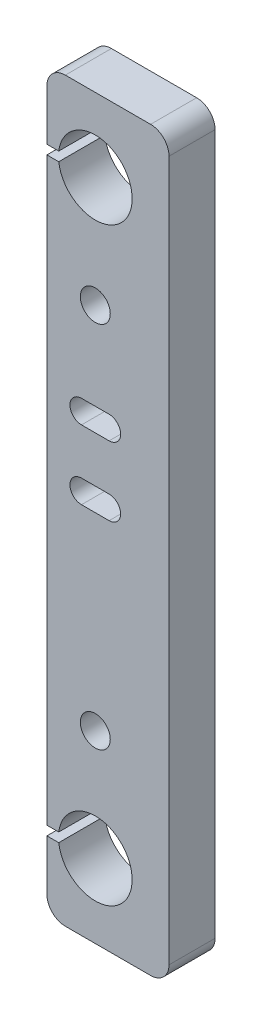
ISO-10303-21;
HEADER;
FILE_DESCRIPTION(('STEP AP214'),'2;1');
FILE_NAME('part.step','',(''),(''),'','','');
FILE_SCHEMA(('AUTOMOTIVE_DESIGN { 1 0 10303 214 1 1 1 1 }'));
ENDSEC;
DATA;
#1=APPLICATION_CONTEXT('core data for automotive mechanical design processes');
#2=APPLICATION_PROTOCOL_DEFINITION('international standard','automotive_design',2000,#1);
#3=PRODUCT_CONTEXT('',#1,'mechanical');
#4=PRODUCT('Part','Part','',(#3));
#5=PRODUCT_RELATED_PRODUCT_CATEGORY('part','',(#4));
#6=PRODUCT_DEFINITION_FORMATION('','',#4);
#7=PRODUCT_DEFINITION_CONTEXT('part definition',#1,'design');
#8=PRODUCT_DEFINITION('design','',#6,#7);
#9=PRODUCT_DEFINITION_SHAPE('','',#8);
#10=(LENGTH_UNIT() NAMED_UNIT(*) SI_UNIT(.MILLI.,.METRE.));
#11=(NAMED_UNIT(*) PLANE_ANGLE_UNIT() SI_UNIT($,.RADIAN.));
#12=(NAMED_UNIT(*) SI_UNIT($,.STERADIAN.) SOLID_ANGLE_UNIT());
#13=UNCERTAINTY_MEASURE_WITH_UNIT(LENGTH_MEASURE(1.E-05),#10,'distance_accuracy_value','');
#14=(GEOMETRIC_REPRESENTATION_CONTEXT(3) GLOBAL_UNCERTAINTY_ASSIGNED_CONTEXT((#13)) GLOBAL_UNIT_ASSIGNED_CONTEXT((#10,
#11,#12)) REPRESENTATION_CONTEXT('',''));
#15=CARTESIAN_POINT('',(0.,0.,0.));
#16=DIRECTION('',(0.,0.,1.));
#17=DIRECTION('',(1.,0.,0.));
#18=AXIS2_PLACEMENT_3D('',#15,#16,#17);
#19=CARTESIAN_POINT('',(0.,0.,5.));
#20=DIRECTION('',(0.,0.,-1.));
#21=DIRECTION('',(-1.,0.,0.));
#22=AXIS2_PLACEMENT_3D('',#19,#20,#21);
#23=PLANE('',#22);
#24=CARTESIAN_POINT('',(6.5,49.25,5.));
#25=DIRECTION('',(0.,0.,1.));
#26=DIRECTION('',(1.,0.,0.));
#27=AXIS2_PLACEMENT_3D('',#24,#25,#26);
#28=CIRCLE('',#27,1.24999999999999);
#29=CARTESIAN_POINT('',(6.5,50.5,5.));
#30=VERTEX_POINT('',#29);
#31=CARTESIAN_POINT('',(6.49999999999999,48.,5.));
#32=VERTEX_POINT('',#31);
#33=EDGE_CURVE('E288',#30,#32,#28,.T.);
#34=ORIENTED_EDGE('',*,*,#33,.F.);
#35=DIRECTION('',(-1.,0.,0.));
#36=VECTOR('',#35,1.);
#37=CARTESIAN_POINT('',(6.5,50.5,5.));
#38=LINE('',#37,#36);
#39=CARTESIAN_POINT('',(9.49999999999999,50.5,5.));
#40=VERTEX_POINT('',#39);
#41=EDGE_CURVE('E296',#40,#30,#38,.T.);
#42=ORIENTED_EDGE('',*,*,#41,.F.);
#43=CARTESIAN_POINT('',(9.49999999999999,49.25,5.));
#44=DIRECTION('',(0.,0.,1.));
#45=DIRECTION('',(1.,0.,0.));
#46=AXIS2_PLACEMENT_3D('',#43,#44,#45);
#47=CIRCLE('',#46,1.24999999999999);
#48=CARTESIAN_POINT('',(9.49999999999999,48.,5.));
#49=VERTEX_POINT('',#48);
#50=EDGE_CURVE('E293',#49,#40,#47,.T.);
#51=ORIENTED_EDGE('',*,*,#50,.F.);
#52=DIRECTION('',(1.,0.,0.));
#53=VECTOR('',#52,1.);
#54=CARTESIAN_POINT('',(6.49999999999999,48.,5.));
#55=LINE('',#54,#53);
#56=EDGE_CURVE('E290',#32,#49,#55,.T.);
#57=ORIENTED_EDGE('',*,*,#56,.F.);
#58=EDGE_LOOP('',(#34,#42,#51,#57));
#59=FACE_BOUND('',#58,.T.);
#60=DIRECTION('',(0.,-1.,0.));
#61=VECTOR('',#60,1.);
#62=CARTESIAN_POINT('',(2.75,80.,5.));
#63=LINE('',#62,#61);
#64=CARTESIAN_POINT('',(2.75,7.5,5.));
#65=VERTEX_POINT('',#64);
#66=CARTESIAN_POINT('',(2.74999999999999,2.,5.));
#67=VERTEX_POINT('',#66);
#68=EDGE_CURVE('E403',#65,#67,#63,.T.);
#69=ORIENTED_EDGE('',*,*,#68,.T.);
#70=CARTESIAN_POINT('',(4.74999999999999,2.,5.));
#71=DIRECTION('',(0.,0.,-1.));
#72=DIRECTION('',(-1.,0.,0.));
#73=AXIS2_PLACEMENT_3D('',#70,#71,#72);
#74=CIRCLE('',#73,2.);
#75=CARTESIAN_POINT('',(4.74999999999999,0.,5.));
#76=VERTEX_POINT('',#75);
#77=EDGE_CURVE('E375',#67,#76,#74,.F.);
#78=ORIENTED_EDGE('',*,*,#77,.T.);
#79=DIRECTION('',(1.,0.,0.));
#80=VECTOR('',#79,1.);
#81=CARTESIAN_POINT('',(0.,0.,5.));
#82=LINE('',#81,#80);
#83=CARTESIAN_POINT('',(14.,0.,5.));
#84=VERTEX_POINT('',#83);
#85=EDGE_CURVE('E329',#76,#84,#82,.T.);
#86=ORIENTED_EDGE('',*,*,#85,.T.);
#87=CARTESIAN_POINT('',(14.,2.,5.));
#88=DIRECTION('',(0.,0.,-1.));
#89=DIRECTION('',(-1.,0.,0.));
#90=AXIS2_PLACEMENT_3D('',#87,#88,#89);
#91=CIRCLE('',#90,2.);
#92=CARTESIAN_POINT('',(16.,2.,5.));
#93=VERTEX_POINT('',#92);
#94=EDGE_CURVE('E54',#84,#93,#91,.F.);
#95=ORIENTED_EDGE('',*,*,#94,.T.);
#96=DIRECTION('',(0.,1.,0.));
#97=VECTOR('',#96,1.);
#98=CARTESIAN_POINT('',(16.,0.,5.));
#99=LINE('',#98,#97);
#100=CARTESIAN_POINT('',(16.,78.,5.));
#101=VERTEX_POINT('',#100);
#102=EDGE_CURVE('E331',#93,#101,#99,.T.);
#103=ORIENTED_EDGE('',*,*,#102,.T.);
#104=CARTESIAN_POINT('',(14.,78.,5.));
#105=DIRECTION('',(0.,0.,-1.));
#106=DIRECTION('',(-1.,0.,0.));
#107=AXIS2_PLACEMENT_3D('',#104,#105,#106);
#108=CIRCLE('',#107,2.);
#109=CARTESIAN_POINT('',(14.,80.,5.));
#110=VERTEX_POINT('',#109);
#111=EDGE_CURVE('E370',#101,#110,#108,.F.);
#112=ORIENTED_EDGE('',*,*,#111,.T.);
#113=DIRECTION('',(-1.,0.,0.));
#114=VECTOR('',#113,1.);
#115=CARTESIAN_POINT('',(0.,80.,5.));
#116=LINE('',#115,#114);
#117=CARTESIAN_POINT('',(4.75,80.,5.));
#118=VERTEX_POINT('',#117);
#119=EDGE_CURVE('E334',#110,#118,#116,.T.);
#120=ORIENTED_EDGE('',*,*,#119,.T.);
#121=CARTESIAN_POINT('',(4.75,78.,5.));
#122=DIRECTION('',(0.,0.,-1.));
#123=DIRECTION('',(-1.,0.,0.));
#124=AXIS2_PLACEMENT_3D('',#121,#122,#123);
#125=CIRCLE('',#124,2.);
#126=CARTESIAN_POINT('',(2.75,78.,5.));
#127=VERTEX_POINT('',#126);
#128=EDGE_CURVE('E373',#118,#127,#125,.F.);
#129=ORIENTED_EDGE('',*,*,#128,.T.);
#130=CARTESIAN_POINT('',(2.75,72.5,5.));
#131=VERTEX_POINT('',#130);
#132=EDGE_CURVE('E205',#127,#131,#63,.T.);
#133=ORIENTED_EDGE('',*,*,#132,.T.);
#134=DIRECTION('',(1.,0.,0.));
#135=VECTOR('',#134,1.);
#136=CARTESIAN_POINT('',(8.,72.5,5.));
#137=LINE('',#136,#135);
#138=CARTESIAN_POINT('',(4.03137303340311,72.5,5.));
#139=VERTEX_POINT('',#138);
#140=EDGE_CURVE('E232',#131,#139,#137,.T.);
#141=ORIENTED_EDGE('',*,*,#140,.T.);
#142=CARTESIAN_POINT('',(8.,72.,5.));
#143=DIRECTION('',(0.,0.,1.));
#144=DIRECTION('',(1.,0.,0.));
#145=AXIS2_PLACEMENT_3D('',#142,#143,#144);
#146=CIRCLE('',#145,4.00000000000001);
#147=CARTESIAN_POINT('',(4.03137303340311,71.5,5.));
#148=VERTEX_POINT('',#147);
#149=EDGE_CURVE('E324',#148,#139,#146,.T.);
#150=ORIENTED_EDGE('',*,*,#149,.F.);
#151=DIRECTION('',(-1.,0.,0.));
#152=VECTOR('',#151,1.);
#153=CARTESIAN_POINT('',(8.,71.5,5.));
#154=LINE('',#153,#152);
#155=CARTESIAN_POINT('',(2.75,71.5,5.));
#156=VERTEX_POINT('',#155);
#157=EDGE_CURVE('E227',#148,#156,#154,.T.);
#158=ORIENTED_EDGE('',*,*,#157,.T.);
#159=CARTESIAN_POINT('',(2.74999999999999,8.50000000000001,5.));
#160=VERTEX_POINT('',#159);
#161=EDGE_CURVE('E200',#156,#160,#63,.T.);
#162=ORIENTED_EDGE('',*,*,#161,.T.);
#163=DIRECTION('',(1.,0.,0.));
#164=VECTOR('',#163,1.);
#165=CARTESIAN_POINT('',(8.00000000000001,8.5,5.));
#166=LINE('',#165,#164);
#167=CARTESIAN_POINT('',(4.03137303340312,8.5,5.));
#168=VERTEX_POINT('',#167);
#169=EDGE_CURVE('E238',#160,#168,#166,.T.);
#170=ORIENTED_EDGE('',*,*,#169,.T.);
#171=CARTESIAN_POINT('',(8.00000000000001,8.,5.));
#172=DIRECTION('',(0.,0.,1.));
#173=DIRECTION('',(1.,0.,0.));
#174=AXIS2_PLACEMENT_3D('',#171,#172,#173);
#175=CIRCLE('',#174,4.);
#176=CARTESIAN_POINT('',(4.03137303340312,7.5,5.));
#177=VERTEX_POINT('',#176);
#178=EDGE_CURVE('E319',#177,#168,#175,.T.);
#179=ORIENTED_EDGE('',*,*,#178,.F.);
#180=DIRECTION('',(-1.,0.,0.));
#181=VECTOR('',#180,1.);
#182=CARTESIAN_POINT('',(8.00000000000001,7.5,5.));
#183=LINE('',#182,#181);
#184=EDGE_CURVE('E235',#177,#65,#183,.T.);
#185=ORIENTED_EDGE('',*,*,#184,.T.);
#186=EDGE_LOOP('',(#69,#78,#86,#95,#103,#112,#120,#129,#133,#141,#150,#158,#162,#170,#179,#185));
#187=FACE_BOUND('',#186,.T.);
#188=CARTESIAN_POINT('',(6.49999999999999,41.75,5.));
#189=DIRECTION('',(0.,0.,1.));
#190=DIRECTION('',(1.,0.,0.));
#191=AXIS2_PLACEMENT_3D('',#188,#189,#190);
#192=CIRCLE('',#191,1.25);
#193=CARTESIAN_POINT('',(6.49999999999999,43.,5.));
#194=VERTEX_POINT('',#193);
#195=CARTESIAN_POINT('',(6.49999999999999,40.5,5.));
#196=VERTEX_POINT('',#195);
#197=EDGE_CURVE('E257',#194,#196,#192,.T.);
#198=ORIENTED_EDGE('',*,*,#197,.F.);
#199=DIRECTION('',(-1.,0.,0.));
#200=VECTOR('',#199,1.);
#201=CARTESIAN_POINT('',(6.49999999999999,43.,5.));
#202=LINE('',#201,#200);
#203=CARTESIAN_POINT('',(9.5,43.,5.));
#204=VERTEX_POINT('',#203);
#205=EDGE_CURVE('E265',#204,#194,#202,.T.);
#206=ORIENTED_EDGE('',*,*,#205,.F.);
#207=CARTESIAN_POINT('',(9.49999999999999,41.75,5.));
#208=DIRECTION('',(0.,0.,1.));
#209=DIRECTION('',(1.,0.,0.));
#210=AXIS2_PLACEMENT_3D('',#207,#208,#209);
#211=CIRCLE('',#210,1.25);
#212=CARTESIAN_POINT('',(9.5,40.5,5.));
#213=VERTEX_POINT('',#212);
#214=EDGE_CURVE('E262',#213,#204,#211,.T.);
#215=ORIENTED_EDGE('',*,*,#214,.F.);
#216=DIRECTION('',(1.,0.,0.));
#217=VECTOR('',#216,1.);
#218=CARTESIAN_POINT('',(6.49999999999999,40.5,5.));
#219=LINE('',#218,#217);
#220=EDGE_CURVE('E259',#196,#213,#219,.T.);
#221=ORIENTED_EDGE('',*,*,#220,.F.);
#222=EDGE_LOOP('',(#198,#206,#215,#221));
#223=FACE_BOUND('',#222,.T.);
#224=CARTESIAN_POINT('',(8.00000000000001,20.,5.));
#225=DIRECTION('',(0.,0.,1.));
#226=DIRECTION('',(1.,0.,0.));
#227=AXIS2_PLACEMENT_3D('',#224,#225,#226);
#228=CIRCLE('',#227,1.625);
#229=CARTESIAN_POINT('',(9.62500000000001,20.,5.));
#230=VERTEX_POINT('',#229);
#231=EDGE_CURVE('E251',#230,#230,#228,.T.);
#232=ORIENTED_EDGE('',*,*,#231,.F.);
#233=EDGE_LOOP('',(#232));
#234=FACE_BOUND('',#233,.T.);
#235=CARTESIAN_POINT('',(8.,60.,5.));
#236=DIRECTION('',(0.,0.,1.));
#237=DIRECTION('',(1.,0.,0.));
#238=AXIS2_PLACEMENT_3D('',#235,#236,#237);
#239=CIRCLE('',#238,1.625);
#240=CARTESIAN_POINT('',(9.62500000000001,60.,5.));
#241=VERTEX_POINT('',#240);
#242=EDGE_CURVE('E245',#241,#241,#239,.T.);
#243=ORIENTED_EDGE('',*,*,#242,.F.);
#244=EDGE_LOOP('',(#243));
#245=FACE_BOUND('',#244,.T.);
#246=ADVANCED_FACE('F33',(#59,#187,#223,#234,#245),#23,.F.);
#247=CARTESIAN_POINT('',(0.,0.,0.));
#248=DIRECTION('',(0.,0.,-1.));
#249=DIRECTION('',(-1.,0.,0.));
#250=AXIS2_PLACEMENT_3D('',#247,#248,#249);
#251=PLANE('',#250);
#252=DIRECTION('',(1.,0.,0.));
#253=VECTOR('',#252,1.);
#254=CARTESIAN_POINT('',(0.,0.,0.));
#255=LINE('',#254,#253);
#256=CARTESIAN_POINT('',(4.74999999999999,0.,0.));
#257=VERTEX_POINT('',#256);
#258=CARTESIAN_POINT('',(14.,0.,0.));
#259=VERTEX_POINT('',#258);
#260=EDGE_CURVE('E327',#257,#259,#255,.T.);
#261=ORIENTED_EDGE('',*,*,#260,.F.);
#262=CARTESIAN_POINT('',(4.74999999999999,2.,0.));
#263=DIRECTION('',(0.,0.,-1.));
#264=DIRECTION('',(-1.,0.,0.));
#265=AXIS2_PLACEMENT_3D('',#262,#263,#264);
#266=CIRCLE('',#265,2.);
#267=CARTESIAN_POINT('',(2.74999999999999,2.,0.));
#268=VERTEX_POINT('',#267);
#269=EDGE_CURVE('E366',#257,#268,#266,.T.);
#270=ORIENTED_EDGE('',*,*,#269,.T.);
#271=DIRECTION('',(0.,-1.,0.));
#272=VECTOR('',#271,1.);
#273=CARTESIAN_POINT('',(2.75,80.,0.));
#274=LINE('',#273,#272);
#275=CARTESIAN_POINT('',(2.74999999999999,7.49999999999999,0.));
#276=VERTEX_POINT('',#275);
#277=EDGE_CURVE('E219',#276,#268,#274,.T.);
#278=ORIENTED_EDGE('',*,*,#277,.F.);
#279=DIRECTION('',(-1.,0.,0.));
#280=VECTOR('',#279,1.);
#281=CARTESIAN_POINT('',(8.00000000000001,7.5,0.));
#282=LINE('',#281,#280);
#283=CARTESIAN_POINT('',(4.03137303340312,7.5,0.));
#284=VERTEX_POINT('',#283);
#285=EDGE_CURVE('E241',#284,#276,#282,.T.);
#286=ORIENTED_EDGE('',*,*,#285,.F.);
#287=CARTESIAN_POINT('',(8.00000000000001,8.,0.));
#288=DIRECTION('',(0.,0.,1.));
#289=DIRECTION('',(1.,0.,0.));
#290=AXIS2_PLACEMENT_3D('',#287,#288,#289);
#291=CIRCLE('',#290,4.);
#292=CARTESIAN_POINT('',(4.03137303340312,8.5,0.));
#293=VERTEX_POINT('',#292);
#294=EDGE_CURVE('E318',#284,#293,#291,.T.);
#295=ORIENTED_EDGE('',*,*,#294,.T.);
#296=DIRECTION('',(1.,0.,0.));
#297=VECTOR('',#296,1.);
#298=CARTESIAN_POINT('',(8.00000000000001,8.5,0.));
#299=LINE('',#298,#297);
#300=CARTESIAN_POINT('',(2.74999999999999,8.50000000000001,0.));
#301=VERTEX_POINT('',#300);
#302=EDGE_CURVE('E217',#301,#293,#299,.T.);
#303=ORIENTED_EDGE('',*,*,#302,.F.);
#304=CARTESIAN_POINT('',(2.75,71.5,0.));
#305=VERTEX_POINT('',#304);
#306=EDGE_CURVE('E197',#305,#301,#274,.T.);
#307=ORIENTED_EDGE('',*,*,#306,.F.);
#308=DIRECTION('',(-1.,0.,0.));
#309=VECTOR('',#308,1.);
#310=CARTESIAN_POINT('',(8.,71.5,0.));
#311=LINE('',#310,#309);
#312=CARTESIAN_POINT('',(4.03137303340311,71.5,0.));
#313=VERTEX_POINT('',#312);
#314=EDGE_CURVE('E214',#313,#305,#311,.T.);
#315=ORIENTED_EDGE('',*,*,#314,.F.);
#316=CARTESIAN_POINT('',(8.,72.,0.));
#317=DIRECTION('',(0.,0.,1.));
#318=DIRECTION('',(1.,0.,0.));
#319=AXIS2_PLACEMENT_3D('',#316,#317,#318);
#320=CIRCLE('',#319,4.00000000000001);
#321=CARTESIAN_POINT('',(4.03137303340311,72.5,0.));
#322=VERTEX_POINT('',#321);
#323=EDGE_CURVE('E322',#313,#322,#320,.T.);
#324=ORIENTED_EDGE('',*,*,#323,.T.);
#325=DIRECTION('',(1.,0.,0.));
#326=VECTOR('',#325,1.);
#327=CARTESIAN_POINT('',(8.,72.5,0.));
#328=LINE('',#327,#326);
#329=CARTESIAN_POINT('',(2.75,72.5,0.));
#330=VERTEX_POINT('',#329);
#331=EDGE_CURVE('E224',#330,#322,#328,.T.);
#332=ORIENTED_EDGE('',*,*,#331,.F.);
#333=CARTESIAN_POINT('',(2.75,78.,0.));
#334=VERTEX_POINT('',#333);
#335=EDGE_CURVE('E218',#334,#330,#274,.T.);
#336=ORIENTED_EDGE('',*,*,#335,.F.);
#337=CARTESIAN_POINT('',(4.75,78.,0.));
#338=DIRECTION('',(0.,0.,-1.));
#339=DIRECTION('',(-1.,0.,0.));
#340=AXIS2_PLACEMENT_3D('',#337,#338,#339);
#341=CIRCLE('',#340,2.);
#342=CARTESIAN_POINT('',(4.75,80.,0.));
#343=VERTEX_POINT('',#342);
#344=EDGE_CURVE('E364',#334,#343,#341,.T.);
#345=ORIENTED_EDGE('',*,*,#344,.T.);
#346=DIRECTION('',(-1.,0.,0.));
#347=VECTOR('',#346,1.);
#348=CARTESIAN_POINT('',(0.,80.,0.));
#349=LINE('',#348,#347);
#350=CARTESIAN_POINT('',(14.,80.,0.));
#351=VERTEX_POINT('',#350);
#352=EDGE_CURVE('E332',#351,#343,#349,.T.);
#353=ORIENTED_EDGE('',*,*,#352,.F.);
#354=CARTESIAN_POINT('',(14.,78.,0.));
#355=DIRECTION('',(0.,0.,-1.));
#356=DIRECTION('',(-1.,0.,0.));
#357=AXIS2_PLACEMENT_3D('',#354,#355,#356);
#358=CIRCLE('',#357,2.);
#359=CARTESIAN_POINT('',(16.,78.,0.));
#360=VERTEX_POINT('',#359);
#361=EDGE_CURVE('E360',#351,#360,#358,.T.);
#362=ORIENTED_EDGE('',*,*,#361,.T.);
#363=DIRECTION('',(0.,1.,0.));
#364=VECTOR('',#363,1.);
#365=CARTESIAN_POINT('',(16.,0.,0.));
#366=LINE('',#365,#364);
#367=CARTESIAN_POINT('',(16.,2.,0.));
#368=VERTEX_POINT('',#367);
#369=EDGE_CURVE('E340',#368,#360,#366,.T.);
#370=ORIENTED_EDGE('',*,*,#369,.F.);
#371=CARTESIAN_POINT('',(14.,2.,0.));
#372=DIRECTION('',(0.,0.,-1.));
#373=DIRECTION('',(-1.,0.,0.));
#374=AXIS2_PLACEMENT_3D('',#371,#372,#373);
#375=CIRCLE('',#374,2.);
#376=EDGE_CURVE('E362',#368,#259,#375,.T.);
#377=ORIENTED_EDGE('',*,*,#376,.T.);
#378=EDGE_LOOP('',(#261,#270,#278,#286,#295,#303,#307,#315,#324,#332,#336,#345,#353,#362,#370,#377));
#379=FACE_BOUND('',#378,.T.);
#380=CARTESIAN_POINT('',(8.00000000000001,20.,0.));
#381=DIRECTION('',(0.,0.,1.));
#382=DIRECTION('',(1.,0.,0.));
#383=AXIS2_PLACEMENT_3D('',#380,#381,#382);
#384=CIRCLE('',#383,1.625);
#385=CARTESIAN_POINT('',(9.62500000000001,20.,0.));
#386=VERTEX_POINT('',#385);
#387=EDGE_CURVE('E248',#386,#386,#384,.T.);
#388=ORIENTED_EDGE('',*,*,#387,.T.);
#389=EDGE_LOOP('',(#388));
#390=FACE_BOUND('',#389,.T.);
#391=DIRECTION('',(-1.,0.,0.));
#392=VECTOR('',#391,1.);
#393=CARTESIAN_POINT('',(6.5,50.5,0.));
#394=LINE('',#393,#392);
#395=CARTESIAN_POINT('',(9.49999999999999,50.5,0.));
#396=VERTEX_POINT('',#395);
#397=CARTESIAN_POINT('',(6.5,50.5,0.));
#398=VERTEX_POINT('',#397);
#399=EDGE_CURVE('E291',#396,#398,#394,.T.);
#400=ORIENTED_EDGE('',*,*,#399,.T.);
#401=CARTESIAN_POINT('',(6.5,49.25,0.));
#402=DIRECTION('',(0.,0.,1.));
#403=DIRECTION('',(1.,0.,0.));
#404=AXIS2_PLACEMENT_3D('',#401,#402,#403);
#405=CIRCLE('',#404,1.24999999999999);
#406=CARTESIAN_POINT('',(6.49999999999999,48.,0.));
#407=VERTEX_POINT('',#406);
#408=EDGE_CURVE('E287',#398,#407,#405,.T.);
#409=ORIENTED_EDGE('',*,*,#408,.T.);
#410=DIRECTION('',(1.,0.,0.));
#411=VECTOR('',#410,1.);
#412=CARTESIAN_POINT('',(6.49999999999999,48.,0.));
#413=LINE('',#412,#411);
#414=CARTESIAN_POINT('',(9.49999999999999,48.,0.));
#415=VERTEX_POINT('',#414);
#416=EDGE_CURVE('E301',#407,#415,#413,.T.);
#417=ORIENTED_EDGE('',*,*,#416,.T.);
#418=CARTESIAN_POINT('',(9.49999999999999,49.25,0.));
#419=DIRECTION('',(0.,0.,1.));
#420=DIRECTION('',(1.,0.,0.));
#421=AXIS2_PLACEMENT_3D('',#418,#419,#420);
#422=CIRCLE('',#421,1.24999999999999);
#423=EDGE_CURVE('E304',#415,#396,#422,.T.);
#424=ORIENTED_EDGE('',*,*,#423,.T.);
#425=EDGE_LOOP('',(#400,#409,#417,#424));
#426=FACE_BOUND('',#425,.T.);
#427=DIRECTION('',(-1.,0.,0.));
#428=VECTOR('',#427,1.);
#429=CARTESIAN_POINT('',(6.49999999999999,43.,0.));
#430=LINE('',#429,#428);
#431=CARTESIAN_POINT('',(9.5,43.,0.));
#432=VERTEX_POINT('',#431);
#433=CARTESIAN_POINT('',(6.49999999999999,43.,0.));
#434=VERTEX_POINT('',#433);
#435=EDGE_CURVE('E260',#432,#434,#430,.T.);
#436=ORIENTED_EDGE('',*,*,#435,.T.);
#437=CARTESIAN_POINT('',(6.49999999999999,41.75,0.));
#438=DIRECTION('',(0.,0.,1.));
#439=DIRECTION('',(1.,0.,0.));
#440=AXIS2_PLACEMENT_3D('',#437,#438,#439);
#441=CIRCLE('',#440,1.25);
#442=CARTESIAN_POINT('',(6.49999999999999,40.5,0.));
#443=VERTEX_POINT('',#442);
#444=EDGE_CURVE('E254',#434,#443,#441,.T.);
#445=ORIENTED_EDGE('',*,*,#444,.T.);
#446=DIRECTION('',(1.,0.,0.));
#447=VECTOR('',#446,1.);
#448=CARTESIAN_POINT('',(6.49999999999999,40.5,0.));
#449=LINE('',#448,#447);
#450=CARTESIAN_POINT('',(9.5,40.5,0.));
#451=VERTEX_POINT('',#450);
#452=EDGE_CURVE('E270',#443,#451,#449,.T.);
#453=ORIENTED_EDGE('',*,*,#452,.T.);
#454=CARTESIAN_POINT('',(9.49999999999999,41.75,0.));
#455=DIRECTION('',(0.,0.,1.));
#456=DIRECTION('',(1.,0.,0.));
#457=AXIS2_PLACEMENT_3D('',#454,#455,#456);
#458=CIRCLE('',#457,1.25);
#459=EDGE_CURVE('E273',#451,#432,#458,.T.);
#460=ORIENTED_EDGE('',*,*,#459,.T.);
#461=EDGE_LOOP('',(#436,#445,#453,#460));
#462=FACE_BOUND('',#461,.T.);
#463=CARTESIAN_POINT('',(8.,60.,0.));
#464=DIRECTION('',(0.,0.,1.));
#465=DIRECTION('',(1.,0.,0.));
#466=AXIS2_PLACEMENT_3D('',#463,#464,#465);
#467=CIRCLE('',#466,1.625);
#468=CARTESIAN_POINT('',(9.62500000000001,60.,0.));
#469=VERTEX_POINT('',#468);
#470=EDGE_CURVE('E240',#469,#469,#467,.T.);
#471=ORIENTED_EDGE('',*,*,#470,.T.);
#472=EDGE_LOOP('',(#471));
#473=FACE_BOUND('',#472,.T.);
#474=ADVANCED_FACE('F211',(#379,#390,#426,#462,#473),#251,.T.);
#475=CARTESIAN_POINT('',(0.,0.,5.));
#476=DIRECTION('',(0.,1.,0.));
#477=DIRECTION('',(-1.,0.,0.));
#478=AXIS2_PLACEMENT_3D('',#475,#476,#477);
#479=PLANE('',#478);
#480=ORIENTED_EDGE('',*,*,#85,.F.);
#481=DIRECTION('',(0.,0.,-1.));
#482=VECTOR('',#481,1.);
#483=CARTESIAN_POINT('',(4.74999999999999,0.,5.));
#484=LINE('',#483,#482);
#485=EDGE_CURVE('E357',#76,#257,#484,.T.);
#486=ORIENTED_EDGE('',*,*,#485,.T.);
#487=ORIENTED_EDGE('',*,*,#260,.T.);
#488=DIRECTION('',(0.,0.,-1.));
#489=VECTOR('',#488,1.);
#490=CARTESIAN_POINT('',(14.,0.,5.));
#491=LINE('',#490,#489);
#492=EDGE_CURVE('E355',#259,#84,#491,.F.);
#493=ORIENTED_EDGE('',*,*,#492,.T.);
#494=EDGE_LOOP('',(#480,#486,#487,#493));
#495=FACE_BOUND('',#494,.T.);
#496=ADVANCED_FACE('F417',(#495),#479,.F.);
#497=CARTESIAN_POINT('',(16.,0.,5.));
#498=DIRECTION('',(-1.,0.,0.));
#499=DIRECTION('',(0.,-1.,0.));
#500=AXIS2_PLACEMENT_3D('',#497,#498,#499);
#501=PLANE('',#500);
#502=ORIENTED_EDGE('',*,*,#102,.F.);
#503=DIRECTION('',(0.,0.,-1.));
#504=VECTOR('',#503,1.);
#505=CARTESIAN_POINT('',(16.,2.,5.));
#506=LINE('',#505,#504);
#507=EDGE_CURVE('E11',#93,#368,#506,.T.);
#508=ORIENTED_EDGE('',*,*,#507,.T.);
#509=ORIENTED_EDGE('',*,*,#369,.T.);
#510=DIRECTION('',(0.,0.,-1.));
#511=VECTOR('',#510,1.);
#512=CARTESIAN_POINT('',(16.,78.,5.));
#513=LINE('',#512,#511);
#514=EDGE_CURVE('E41',#360,#101,#513,.F.);
#515=ORIENTED_EDGE('',*,*,#514,.T.);
#516=EDGE_LOOP('',(#502,#508,#509,#515));
#517=FACE_BOUND('',#516,.T.);
#518=ADVANCED_FACE('F423',(#517),#501,.F.);
#519=CARTESIAN_POINT('',(0.,80.,5.));
#520=DIRECTION('',(0.,-1.,0.));
#521=DIRECTION('',(0.,0.,-1.));
#522=AXIS2_PLACEMENT_3D('',#519,#520,#521);
#523=PLANE('',#522);
#524=ORIENTED_EDGE('',*,*,#352,.T.);
#525=DIRECTION('',(0.,0.,-1.));
#526=VECTOR('',#525,1.);
#527=CARTESIAN_POINT('',(4.75,80.,5.));
#528=LINE('',#527,#526);
#529=EDGE_CURVE('E383',#343,#118,#528,.F.);
#530=ORIENTED_EDGE('',*,*,#529,.T.);
#531=ORIENTED_EDGE('',*,*,#119,.F.);
#532=DIRECTION('',(0.,0.,-1.));
#533=VECTOR('',#532,1.);
#534=CARTESIAN_POINT('',(14.,80.,5.));
#535=LINE('',#534,#533);
#536=EDGE_CURVE('E380',#110,#351,#535,.T.);
#537=ORIENTED_EDGE('',*,*,#536,.T.);
#538=EDGE_LOOP('',(#524,#530,#531,#537));
#539=FACE_BOUND('',#538,.T.);
#540=ADVANCED_FACE('F387',(#539),#523,.F.);
#541=CARTESIAN_POINT('',(8.,72.,5.));
#542=DIRECTION('',(0.,0.,-1.));
#543=DIRECTION('',(-1.,0.,0.));
#544=AXIS2_PLACEMENT_3D('',#541,#542,#543);
#545=CYLINDRICAL_SURFACE('',#544,4.00000000000001);
#546=DIRECTION('',(0.,0.,-1.));
#547=VECTOR('',#546,1.);
#548=CARTESIAN_POINT('',(4.03137303340311,72.5,5.));
#549=LINE('',#548,#547);
#550=EDGE_CURVE('E349',#322,#139,#549,.F.);
#551=ORIENTED_EDGE('',*,*,#550,.F.);
#552=ORIENTED_EDGE('',*,*,#323,.F.);
#553=DIRECTION('',(0.,0.,-1.));
#554=VECTOR('',#553,1.);
#555=CARTESIAN_POINT('',(4.03137303340311,71.5,5.));
#556=LINE('',#555,#554);
#557=EDGE_CURVE('E223',#148,#313,#556,.T.);
#558=ORIENTED_EDGE('',*,*,#557,.F.);
#559=ORIENTED_EDGE('',*,*,#149,.T.);
#560=EDGE_LOOP('',(#551,#552,#558,#559));
#561=FACE_BOUND('',#560,.T.);
#562=ADVANCED_FACE('F438',(#561),#545,.F.);
#563=CARTESIAN_POINT('',(8.00000000000001,8.,5.));
#564=DIRECTION('',(0.,0.,-1.));
#565=DIRECTION('',(-1.,0.,0.));
#566=AXIS2_PLACEMENT_3D('',#563,#564,#565);
#567=CYLINDRICAL_SURFACE('',#566,4.);
#568=DIRECTION('',(0.,0.,-1.));
#569=VECTOR('',#568,1.);
#570=CARTESIAN_POINT('',(4.03137303340312,8.5,5.));
#571=LINE('',#570,#569);
#572=EDGE_CURVE('E345',#293,#168,#571,.F.);
#573=ORIENTED_EDGE('',*,*,#572,.F.);
#574=ORIENTED_EDGE('',*,*,#294,.F.);
#575=DIRECTION('',(0.,0.,-1.));
#576=VECTOR('',#575,1.);
#577=CARTESIAN_POINT('',(4.03137303340312,7.5,5.));
#578=LINE('',#577,#576);
#579=EDGE_CURVE('E337',#177,#284,#578,.T.);
#580=ORIENTED_EDGE('',*,*,#579,.F.);
#581=ORIENTED_EDGE('',*,*,#178,.T.);
#582=EDGE_LOOP('',(#573,#574,#580,#581));
#583=FACE_BOUND('',#582,.T.);
#584=ADVANCED_FACE('F616',(#583),#567,.F.);
#585=CARTESIAN_POINT('',(6.5,49.25,5.));
#586=DIRECTION('',(0.,0.,-1.));
#587=DIRECTION('',(-1.,0.,0.));
#588=AXIS2_PLACEMENT_3D('',#585,#586,#587);
#589=CYLINDRICAL_SURFACE('',#588,1.24999999999999);
#590=ORIENTED_EDGE('',*,*,#408,.F.);
#591=DIRECTION('',(0.,0.,-1.));
#592=VECTOR('',#591,1.);
#593=CARTESIAN_POINT('',(6.5,50.5,5.));
#594=LINE('',#593,#592);
#595=EDGE_CURVE('E298',#30,#398,#594,.T.);
#596=ORIENTED_EDGE('',*,*,#595,.F.);
#597=ORIENTED_EDGE('',*,*,#33,.T.);
#598=DIRECTION('',(0.,0.,-1.));
#599=VECTOR('',#598,1.);
#600=CARTESIAN_POINT('',(6.49999999999999,48.,5.));
#601=LINE('',#600,#599);
#602=EDGE_CURVE('E315',#32,#407,#601,.T.);
#603=ORIENTED_EDGE('',*,*,#602,.T.);
#604=EDGE_LOOP('',(#590,#596,#597,#603));
#605=FACE_BOUND('',#604,.T.);
#606=ADVANCED_FACE('F607',(#605),#589,.F.);
#607=CARTESIAN_POINT('',(6.49999999999999,48.,5.));
#608=DIRECTION('',(0.,1.,0.));
#609=DIRECTION('',(0.,0.,1.));
#610=AXIS2_PLACEMENT_3D('',#607,#608,#609);
#611=PLANE('',#610);
#612=ORIENTED_EDGE('',*,*,#416,.F.);
#613=ORIENTED_EDGE('',*,*,#602,.F.);
#614=ORIENTED_EDGE('',*,*,#56,.T.);
#615=DIRECTION('',(0.,0.,-1.));
#616=VECTOR('',#615,1.);
#617=CARTESIAN_POINT('',(9.49999999999999,48.,5.));
#618=LINE('',#617,#616);
#619=EDGE_CURVE('E313',#49,#415,#618,.T.);
#620=ORIENTED_EDGE('',*,*,#619,.T.);
#621=EDGE_LOOP('',(#612,#613,#614,#620));
#622=FACE_BOUND('',#621,.T.);
#623=ADVANCED_FACE('F598',(#622),#611,.T.);
#624=CARTESIAN_POINT('',(9.49999999999999,49.25,5.));
#625=DIRECTION('',(0.,0.,-1.));
#626=DIRECTION('',(-1.,0.,0.));
#627=AXIS2_PLACEMENT_3D('',#624,#625,#626);
#628=CYLINDRICAL_SURFACE('',#627,1.24999999999999);
#629=ORIENTED_EDGE('',*,*,#423,.F.);
#630=ORIENTED_EDGE('',*,*,#619,.F.);
#631=ORIENTED_EDGE('',*,*,#50,.T.);
#632=DIRECTION('',(0.,0.,-1.));
#633=VECTOR('',#632,1.);
#634=CARTESIAN_POINT('',(9.49999999999999,50.5,5.));
#635=LINE('',#634,#633);
#636=EDGE_CURVE('E311',#40,#396,#635,.T.);
#637=ORIENTED_EDGE('',*,*,#636,.T.);
#638=EDGE_LOOP('',(#629,#630,#631,#637));
#639=FACE_BOUND('',#638,.T.);
#640=ADVANCED_FACE('F589',(#639),#628,.F.);
#641=CARTESIAN_POINT('',(6.5,50.5,5.));
#642=DIRECTION('',(0.,-1.,0.));
#643=DIRECTION('',(0.,0.,-1.));
#644=AXIS2_PLACEMENT_3D('',#641,#642,#643);
#645=PLANE('',#644);
#646=ORIENTED_EDGE('',*,*,#399,.F.);
#647=ORIENTED_EDGE('',*,*,#636,.F.);
#648=ORIENTED_EDGE('',*,*,#41,.T.);
#649=ORIENTED_EDGE('',*,*,#595,.T.);
#650=EDGE_LOOP('',(#646,#647,#648,#649));
#651=FACE_BOUND('',#650,.T.);
#652=ADVANCED_FACE('F580',(#651),#645,.T.);
#653=CARTESIAN_POINT('',(6.49999999999999,41.75,5.));
#654=DIRECTION('',(0.,0.,-1.));
#655=DIRECTION('',(-1.,0.,0.));
#656=AXIS2_PLACEMENT_3D('',#653,#654,#655);
#657=CYLINDRICAL_SURFACE('',#656,1.25);
#658=ORIENTED_EDGE('',*,*,#444,.F.);
#659=DIRECTION('',(0.,0.,-1.));
#660=VECTOR('',#659,1.);
#661=CARTESIAN_POINT('',(6.49999999999999,43.,5.));
#662=LINE('',#661,#660);
#663=EDGE_CURVE('E267',#194,#434,#662,.T.);
#664=ORIENTED_EDGE('',*,*,#663,.F.);
#665=ORIENTED_EDGE('',*,*,#197,.T.);
#666=DIRECTION('',(0.,0.,-1.));
#667=VECTOR('',#666,1.);
#668=CARTESIAN_POINT('',(6.49999999999999,40.5,5.));
#669=LINE('',#668,#667);
#670=EDGE_CURVE('E284',#196,#443,#669,.T.);
#671=ORIENTED_EDGE('',*,*,#670,.T.);
#672=EDGE_LOOP('',(#658,#664,#665,#671));
#673=FACE_BOUND('',#672,.T.);
#674=ADVANCED_FACE('F571',(#673),#657,.F.);
#675=CARTESIAN_POINT('',(6.49999999999999,40.5,5.));
#676=DIRECTION('',(0.,1.,0.));
#677=DIRECTION('',(0.,0.,1.));
#678=AXIS2_PLACEMENT_3D('',#675,#676,#677);
#679=PLANE('',#678);
#680=ORIENTED_EDGE('',*,*,#452,.F.);
#681=ORIENTED_EDGE('',*,*,#670,.F.);
#682=ORIENTED_EDGE('',*,*,#220,.T.);
#683=DIRECTION('',(0.,0.,-1.));
#684=VECTOR('',#683,1.);
#685=CARTESIAN_POINT('',(9.5,40.5,5.));
#686=LINE('',#685,#684);
#687=EDGE_CURVE('E282',#213,#451,#686,.T.);
#688=ORIENTED_EDGE('',*,*,#687,.T.);
#689=EDGE_LOOP('',(#680,#681,#682,#688));
#690=FACE_BOUND('',#689,.T.);
#691=ADVANCED_FACE('F562',(#690),#679,.T.);
#692=CARTESIAN_POINT('',(9.49999999999999,41.75,5.));
#693=DIRECTION('',(0.,0.,-1.));
#694=DIRECTION('',(-1.,0.,0.));
#695=AXIS2_PLACEMENT_3D('',#692,#693,#694);
#696=CYLINDRICAL_SURFACE('',#695,1.25);
#697=ORIENTED_EDGE('',*,*,#459,.F.);
#698=ORIENTED_EDGE('',*,*,#687,.F.);
#699=ORIENTED_EDGE('',*,*,#214,.T.);
#700=DIRECTION('',(0.,0.,-1.));
#701=VECTOR('',#700,1.);
#702=CARTESIAN_POINT('',(9.5,43.,5.));
#703=LINE('',#702,#701);
#704=EDGE_CURVE('E280',#204,#432,#703,.T.);
#705=ORIENTED_EDGE('',*,*,#704,.T.);
#706=EDGE_LOOP('',(#697,#698,#699,#705));
#707=FACE_BOUND('',#706,.T.);
#708=ADVANCED_FACE('F553',(#707),#696,.F.);
#709=CARTESIAN_POINT('',(6.49999999999999,43.,5.));
#710=DIRECTION('',(0.,-1.,0.));
#711=DIRECTION('',(0.,0.,-1.));
#712=AXIS2_PLACEMENT_3D('',#709,#710,#711);
#713=PLANE('',#712);
#714=ORIENTED_EDGE('',*,*,#435,.F.);
#715=ORIENTED_EDGE('',*,*,#704,.F.);
#716=ORIENTED_EDGE('',*,*,#205,.T.);
#717=ORIENTED_EDGE('',*,*,#663,.T.);
#718=EDGE_LOOP('',(#714,#715,#716,#717));
#719=FACE_BOUND('',#718,.T.);
#720=ADVANCED_FACE('F544',(#719),#713,.T.);
#721=CARTESIAN_POINT('',(8.00000000000001,20.,5.));
#722=DIRECTION('',(0.,0.,-1.));
#723=DIRECTION('',(-1.,0.,0.));
#724=AXIS2_PLACEMENT_3D('',#721,#722,#723);
#725=CYLINDRICAL_SURFACE('',#724,1.625);
#726=ORIENTED_EDGE('',*,*,#231,.T.);
#727=EDGE_LOOP('',(#726));
#728=FACE_BOUND('',#727,.T.);
#729=ORIENTED_EDGE('',*,*,#387,.F.);
#730=EDGE_LOOP('',(#729));
#731=FACE_BOUND('',#730,.T.);
#732=ADVANCED_FACE('F534',(#728,#731),#725,.F.);
#733=CARTESIAN_POINT('',(8.,60.,5.));
#734=DIRECTION('',(0.,0.,-1.));
#735=DIRECTION('',(-1.,0.,0.));
#736=AXIS2_PLACEMENT_3D('',#733,#734,#735);
#737=CYLINDRICAL_SURFACE('',#736,1.625);
#738=ORIENTED_EDGE('',*,*,#242,.T.);
#739=EDGE_LOOP('',(#738));
#740=FACE_BOUND('',#739,.T.);
#741=ORIENTED_EDGE('',*,*,#470,.F.);
#742=EDGE_LOOP('',(#741));
#743=FACE_BOUND('',#742,.T.);
#744=ADVANCED_FACE('F524',(#740,#743),#737,.F.);
#745=CARTESIAN_POINT('',(8.00000000000001,7.5,5.));
#746=DIRECTION('',(0.,-1.,0.));
#747=DIRECTION('',(1.,0.,0.));
#748=AXIS2_PLACEMENT_3D('',#745,#746,#747);
#749=PLANE('',#748);
#750=ORIENTED_EDGE('',*,*,#285,.T.);
#751=DIRECTION('',(0.,0.,1.));
#752=VECTOR('',#751,1.);
#753=CARTESIAN_POINT('',(2.75,7.5,5.));
#754=LINE('',#753,#752);
#755=EDGE_CURVE('E225',#276,#65,#754,.T.);
#756=ORIENTED_EDGE('',*,*,#755,.T.);
#757=ORIENTED_EDGE('',*,*,#184,.F.);
#758=ORIENTED_EDGE('',*,*,#579,.T.);
#759=EDGE_LOOP('',(#750,#756,#757,#758));
#760=FACE_BOUND('',#759,.T.);
#761=ADVANCED_FACE('F515',(#760),#749,.F.);
#762=CARTESIAN_POINT('',(8.00000000000001,8.5,5.));
#763=DIRECTION('',(0.,1.,0.));
#764=DIRECTION('',(-1.,0.,0.));
#765=AXIS2_PLACEMENT_3D('',#762,#763,#764);
#766=PLANE('',#765);
#767=ORIENTED_EDGE('',*,*,#169,.F.);
#768=DIRECTION('',(0.,0.,-1.));
#769=VECTOR('',#768,1.);
#770=CARTESIAN_POINT('',(2.75,8.5,5.));
#771=LINE('',#770,#769);
#772=EDGE_CURVE('E204',#160,#301,#771,.T.);
#773=ORIENTED_EDGE('',*,*,#772,.T.);
#774=ORIENTED_EDGE('',*,*,#302,.T.);
#775=ORIENTED_EDGE('',*,*,#572,.T.);
#776=EDGE_LOOP('',(#767,#773,#774,#775));
#777=FACE_BOUND('',#776,.T.);
#778=ADVANCED_FACE('F507',(#777),#766,.F.);
#779=CARTESIAN_POINT('',(8.,71.5,5.));
#780=DIRECTION('',(0.,-1.,0.));
#781=DIRECTION('',(0.,0.,-1.));
#782=AXIS2_PLACEMENT_3D('',#779,#780,#781);
#783=PLANE('',#782);
#784=ORIENTED_EDGE('',*,*,#314,.T.);
#785=DIRECTION('',(0.,0.,1.));
#786=VECTOR('',#785,1.);
#787=CARTESIAN_POINT('',(2.75,71.5,5.));
#788=LINE('',#787,#786);
#789=EDGE_CURVE('E194',#305,#156,#788,.T.);
#790=ORIENTED_EDGE('',*,*,#789,.T.);
#791=ORIENTED_EDGE('',*,*,#157,.F.);
#792=ORIENTED_EDGE('',*,*,#557,.T.);
#793=EDGE_LOOP('',(#784,#790,#791,#792));
#794=FACE_BOUND('',#793,.T.);
#795=ADVANCED_FACE('F221',(#794),#783,.F.);
#796=CARTESIAN_POINT('',(8.,72.5,5.));
#797=DIRECTION('',(0.,1.,0.));
#798=DIRECTION('',(0.,0.,1.));
#799=AXIS2_PLACEMENT_3D('',#796,#797,#798);
#800=PLANE('',#799);
#801=ORIENTED_EDGE('',*,*,#140,.F.);
#802=DIRECTION('',(0.,0.,-1.));
#803=VECTOR('',#802,1.);
#804=CARTESIAN_POINT('',(2.75,72.5,5.));
#805=LINE('',#804,#803);
#806=EDGE_CURVE('E352',#131,#330,#805,.T.);
#807=ORIENTED_EDGE('',*,*,#806,.T.);
#808=ORIENTED_EDGE('',*,*,#331,.T.);
#809=ORIENTED_EDGE('',*,*,#550,.T.);
#810=EDGE_LOOP('',(#801,#807,#808,#809));
#811=FACE_BOUND('',#810,.T.);
#812=ADVANCED_FACE('F492',(#811),#800,.F.);
#813=CARTESIAN_POINT('',(2.75,80.,5.));
#814=DIRECTION('',(1.,0.,0.));
#815=DIRECTION('',(0.,1.,0.));
#816=AXIS2_PLACEMENT_3D('',#813,#814,#815);
#817=PLANE('',#816);
#818=ORIENTED_EDGE('',*,*,#132,.F.);
#819=DIRECTION('',(0.,0.,-1.));
#820=VECTOR('',#819,1.);
#821=CARTESIAN_POINT('',(2.75,78.,5.));
#822=LINE('',#821,#820);
#823=EDGE_CURVE('E377',#127,#334,#822,.T.);
#824=ORIENTED_EDGE('',*,*,#823,.T.);
#825=ORIENTED_EDGE('',*,*,#335,.T.);
#826=ORIENTED_EDGE('',*,*,#806,.F.);
#827=EDGE_LOOP('',(#818,#824,#825,#826));
#828=FACE_BOUND('',#827,.T.);
#829=ADVANCED_FACE('F400',(#828),#817,.F.);
#830=ORIENTED_EDGE('',*,*,#161,.F.);
#831=ORIENTED_EDGE('',*,*,#789,.F.);
#832=ORIENTED_EDGE('',*,*,#306,.T.);
#833=ORIENTED_EDGE('',*,*,#772,.F.);
#834=EDGE_LOOP('',(#830,#831,#832,#833));
#835=FACE_BOUND('',#834,.T.);
#836=ADVANCED_FACE('F196',(#835),#817,.F.);
#837=ORIENTED_EDGE('',*,*,#277,.T.);
#838=DIRECTION('',(0.,0.,-1.));
#839=VECTOR('',#838,1.);
#840=CARTESIAN_POINT('',(2.74999999999999,2.,5.));
#841=LINE('',#840,#839);
#842=EDGE_CURVE('E368',#268,#67,#841,.F.);
#843=ORIENTED_EDGE('',*,*,#842,.T.);
#844=ORIENTED_EDGE('',*,*,#68,.F.);
#845=ORIENTED_EDGE('',*,*,#755,.F.);
#846=EDGE_LOOP('',(#837,#843,#844,#845));
#847=FACE_BOUND('',#846,.T.);
#848=ADVANCED_FACE('F409',(#847),#817,.F.);
#849=CARTESIAN_POINT('',(4.74999999999999,2.,5.));
#850=DIRECTION('',(0.,0.,-1.));
#851=DIRECTION('',(-1.,0.,0.));
#852=AXIS2_PLACEMENT_3D('',#849,#850,#851);
#853=CYLINDRICAL_SURFACE('',#852,2.);
#854=ORIENTED_EDGE('',*,*,#77,.F.);
#855=ORIENTED_EDGE('',*,*,#842,.F.);
#856=ORIENTED_EDGE('',*,*,#269,.F.);
#857=ORIENTED_EDGE('',*,*,#485,.F.);
#858=EDGE_LOOP('',(#854,#855,#856,#857));
#859=FACE_BOUND('',#858,.T.);
#860=ADVANCED_FACE('F413',(#859),#853,.T.);
#861=CARTESIAN_POINT('',(4.75,78.,5.));
#862=DIRECTION('',(0.,0.,-1.));
#863=DIRECTION('',(-1.,0.,0.));
#864=AXIS2_PLACEMENT_3D('',#861,#862,#863);
#865=CYLINDRICAL_SURFACE('',#864,2.);
#866=ORIENTED_EDGE('',*,*,#128,.F.);
#867=ORIENTED_EDGE('',*,*,#529,.F.);
#868=ORIENTED_EDGE('',*,*,#344,.F.);
#869=ORIENTED_EDGE('',*,*,#823,.F.);
#870=EDGE_LOOP('',(#866,#867,#868,#869));
#871=FACE_BOUND('',#870,.T.);
#872=ADVANCED_FACE('F397',(#871),#865,.T.);
#873=CARTESIAN_POINT('',(14.,2.,5.));
#874=DIRECTION('',(0.,0.,-1.));
#875=DIRECTION('',(-1.,0.,0.));
#876=AXIS2_PLACEMENT_3D('',#873,#874,#875);
#877=CYLINDRICAL_SURFACE('',#876,2.);
#878=ORIENTED_EDGE('',*,*,#94,.F.);
#879=ORIENTED_EDGE('',*,*,#492,.F.);
#880=ORIENTED_EDGE('',*,*,#376,.F.);
#881=ORIENTED_EDGE('',*,*,#507,.F.);
#882=EDGE_LOOP('',(#878,#879,#880,#881));
#883=FACE_BOUND('',#882,.T.);
#884=ADVANCED_FACE('F420',(#883),#877,.T.);
#885=CARTESIAN_POINT('',(14.,78.,5.));
#886=DIRECTION('',(0.,0.,-1.));
#887=DIRECTION('',(-1.,0.,0.));
#888=AXIS2_PLACEMENT_3D('',#885,#886,#887);
#889=CYLINDRICAL_SURFACE('',#888,2.);
#890=ORIENTED_EDGE('',*,*,#111,.F.);
#891=ORIENTED_EDGE('',*,*,#514,.F.);
#892=ORIENTED_EDGE('',*,*,#361,.F.);
#893=ORIENTED_EDGE('',*,*,#536,.F.);
#894=EDGE_LOOP('',(#890,#891,#892,#893));
#895=FACE_BOUND('',#894,.T.);
#896=ADVANCED_FACE('F35',(#895),#889,.T.);
#897=CLOSED_SHELL('',(#246,#474,#496,#518,#540,#562,#584,#606,#623,#640,#652,#674,#691,#708,
#720,#732,#744,#761,#778,#795,#812,#829,#836,#848,#860,#872,#884,#896));
#898=MANIFOLD_SOLID_BREP('B2',#897);
#899=ADVANCED_BREP_SHAPE_REPRESENTATION('',(#18,#898),#14);
#900=SHAPE_DEFINITION_REPRESENTATION(#9,#899);
ENDSEC;
END-ISO-10303-21;
